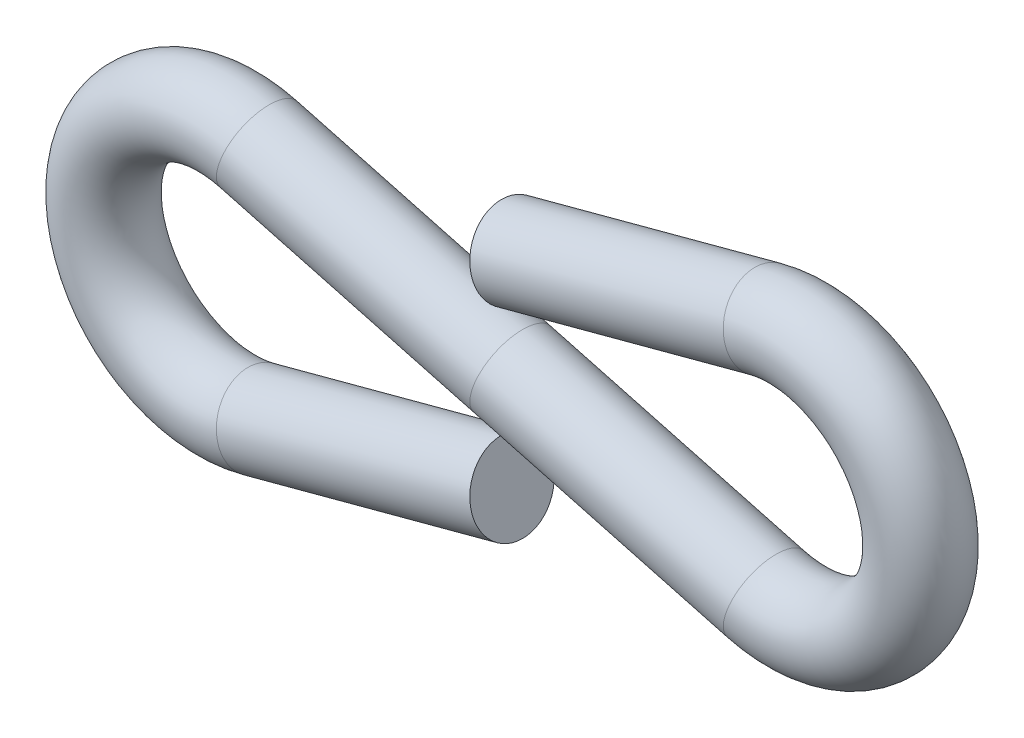
ISO-10303-21;
HEADER;
FILE_DESCRIPTION(('STEP AP214'),'2;1');
FILE_NAME('part.step','',(''),(''),'','','');
FILE_SCHEMA(('AUTOMOTIVE_DESIGN { 1 0 10303 214 1 1 1 1 }'));
ENDSEC;
DATA;
#1=APPLICATION_CONTEXT('core data for automotive mechanical design processes');
#2=APPLICATION_PROTOCOL_DEFINITION('international standard','automotive_design',2000,#1);
#3=PRODUCT_CONTEXT('',#1,'mechanical');
#4=PRODUCT('Part','Part','',(#3));
#5=PRODUCT_RELATED_PRODUCT_CATEGORY('part','',(#4));
#6=PRODUCT_DEFINITION_FORMATION('','',#4);
#7=PRODUCT_DEFINITION_CONTEXT('part definition',#1,'design');
#8=PRODUCT_DEFINITION('design','',#6,#7);
#9=PRODUCT_DEFINITION_SHAPE('','',#8);
#10=(LENGTH_UNIT() NAMED_UNIT(*) SI_UNIT(.MILLI.,.METRE.));
#11=(NAMED_UNIT(*) PLANE_ANGLE_UNIT() SI_UNIT($,.RADIAN.));
#12=(NAMED_UNIT(*) SI_UNIT($,.STERADIAN.) SOLID_ANGLE_UNIT());
#13=UNCERTAINTY_MEASURE_WITH_UNIT(LENGTH_MEASURE(1.E-05),#10,'distance_accuracy_value','');
#14=(GEOMETRIC_REPRESENTATION_CONTEXT(3) GLOBAL_UNCERTAINTY_ASSIGNED_CONTEXT((#13)) GLOBAL_UNIT_ASSIGNED_CONTEXT((#10,
#11,#12)) REPRESENTATION_CONTEXT('',''));
#15=CARTESIAN_POINT('',(0.,0.,0.));
#16=DIRECTION('',(0.,0.,1.));
#17=DIRECTION('',(1.,0.,0.));
#18=AXIS2_PLACEMENT_3D('',#15,#16,#17);
#19=CARTESIAN_POINT('',(0.,7.5,0.));
#20=DIRECTION('',(-0.965925826289069,-0.258819045102518,0.));
#21=DIRECTION('',(0.258819045102518,-0.965925826289069,0.));
#22=AXIS2_PLACEMENT_3D('',#19,#20,#21);
#23=PLANE('',#22);
#24=CARTESIAN_POINT('',(0.,7.5,0.));
#25=DIRECTION('',(-0.965925826289069,-0.258819045102518,0.));
#26=DIRECTION('',(0.258819045102518,-0.965925826289069,0.));
#27=AXIS2_PLACEMENT_3D('',#24,#25,#26);
#28=CIRCLE('',#27,3.);
#29=CARTESIAN_POINT('',(-0.776457135307554,10.3977774788672,0.));
#30=VERTEX_POINT('',#29);
#31=EDGE_CURVE('E72',#30,#30,#28,.T.);
#32=ORIENTED_EDGE('',*,*,#31,.T.);
#33=EDGE_LOOP('',(#32));
#34=FACE_BOUND('',#33,.T.);
#35=ADVANCED_FACE('F47',(#34),#23,.T.);
#36=CARTESIAN_POINT('',(0.,-7.5,0.));
#37=DIRECTION('',(-0.965925826289069,-0.258819045102518,0.));
#38=DIRECTION('',(0.258819045102518,-0.965925826289069,0.));
#39=AXIS2_PLACEMENT_3D('',#36,#37,#38);
#40=PLANE('',#39);
#41=CARTESIAN_POINT('',(0.,-7.5,0.));
#42=DIRECTION('',(-0.965925826289069,-0.258819045102518,0.));
#43=DIRECTION('',(0.258819045102518,-0.965925826289069,0.));
#44=AXIS2_PLACEMENT_3D('',#41,#42,#43);
#45=CIRCLE('',#44,3.);
#46=CARTESIAN_POINT('',(0.776457135307553,-10.3977774788672,0.));
#47=VERTEX_POINT('',#46);
#48=EDGE_CURVE('E11',#47,#47,#45,.T.);
#49=ORIENTED_EDGE('',*,*,#48,.F.);
#50=EDGE_LOOP('',(#49));
#51=FACE_BOUND('',#50,.T.);
#52=ADVANCED_FACE('F80',(#51),#40,.F.);
#53=CARTESIAN_POINT('',(0.,7.5,0.));
#54=DIRECTION('',(0.965925826289069,0.258819045102518,0.));
#55=DIRECTION('',(-0.258819045102518,0.965925826289069,0.));
#56=AXIS2_PLACEMENT_3D('',#53,#54,#55);
#57=CYLINDRICAL_SURFACE('',#56,3.);
#58=CARTESIAN_POINT('',(18.6132067983405,12.4873937301687,0.));
#59=DIRECTION('',(-0.965925826289069,-0.258819045102518,0.));
#60=DIRECTION('',(0.258819045102518,-0.965925826289069,0.));
#61=AXIS2_PLACEMENT_3D('',#58,#59,#60);
#62=CIRCLE('',#61,3.);
#63=CARTESIAN_POINT('',(17.8367496630329,15.385171209036,0.));
#64=VERTEX_POINT('',#63);
#65=EDGE_CURVE('E69',#64,#64,#62,.T.);
#66=CARTESIAN_POINT('',(17.8367496630329,15.385171209036,0.));
#67=CARTESIAN_POINT('',(17.6428620922169,15.3332191910134,0.));
#68=CARTESIAN_POINT('',(17.4489745214008,15.2812671729908,0.));
#69=CARTESIAN_POINT('',(17.0611993797687,15.1773631369456,0.));
#70=CARTESIAN_POINT('',(16.8673118089527,15.125411118923,0.));
#71=CARTESIAN_POINT('',(16.4795366673206,15.0215070828778,0.));
#72=CARTESIAN_POINT('',(16.2856490965045,14.9695550648552,0.));
#73=CARTESIAN_POINT('',(15.8978739548724,14.86565102881,0.));
#74=CARTESIAN_POINT('',(15.7039863840564,14.8136990107875,0.));
#75=CARTESIAN_POINT('',(15.3162112424243,14.7097949747423,0.));
#76=CARTESIAN_POINT('',(15.1223236716082,14.6578429567197,0.));
#77=CARTESIAN_POINT('',(14.7345485299762,14.5539389206745,0.));
#78=CARTESIAN_POINT('',(14.5406609591601,14.5019869026519,0.));
#79=CARTESIAN_POINT('',(14.152885817528,14.3980828666067,0.));
#80=CARTESIAN_POINT('',(13.958998246712,14.3461308485841,0.));
#81=CARTESIAN_POINT('',(13.5712231050799,14.2422268125389,0.));
#82=CARTESIAN_POINT('',(13.3773355342638,14.1902747945164,0.));
#83=CARTESIAN_POINT('',(12.9895603926317,14.0863707584712,0.));
#84=CARTESIAN_POINT('',(12.7956728218157,14.0344187404486,0.));
#85=CARTESIAN_POINT('',(12.4078976801836,13.9305147044034,0.));
#86=CARTESIAN_POINT('',(12.2140101093676,13.8785626863808,0.));
#87=CARTESIAN_POINT('',(11.8262349677355,13.7746586503356,0.));
#88=CARTESIAN_POINT('',(11.6323473969194,13.722706632313,0.));
#89=CARTESIAN_POINT('',(11.2445722552873,13.6188025962679,0.));
#90=CARTESIAN_POINT('',(11.0506846844713,13.5668505782453,0.));
#91=CARTESIAN_POINT('',(10.6629095428392,13.4629465422001,0.));
#92=CARTESIAN_POINT('',(10.4690219720231,13.4109945241775,0.));
#93=CARTESIAN_POINT('',(10.081246830391,13.3070904881323,0.));
#94=CARTESIAN_POINT('',(9.887359259575,13.2551384701097,0.));
#95=CARTESIAN_POINT('',(9.4995841179429,13.1512344340645,0.));
#96=CARTESIAN_POINT('',(9.30569654712686,13.0992824160419,0.));
#97=CARTESIAN_POINT('',(8.91792140549476,12.9953783799968,0.));
#98=CARTESIAN_POINT('',(8.72403383467872,12.9434263619742,0.));
#99=CARTESIAN_POINT('',(8.33625869304663,12.839522325929,0.));
#100=CARTESIAN_POINT('',(8.14237112223058,12.7875703079064,0.));
#101=CARTESIAN_POINT('',(7.75459598059849,12.6836662718612,0.));
#102=CARTESIAN_POINT('',(7.56070840978244,12.6317142538386,0.));
#103=CARTESIAN_POINT('',(7.17293326815035,12.5278102177934,0.));
#104=CARTESIAN_POINT('',(6.9790456973343,12.4758581997709,0.));
#105=CARTESIAN_POINT('',(6.59127055570221,12.3719541637257,0.));
#106=CARTESIAN_POINT('',(6.39738298488616,12.3200021457031,0.));
#107=CARTESIAN_POINT('',(6.00960784325407,12.2160981096579,0.));
#108=CARTESIAN_POINT('',(5.81572027243802,12.1641460916353,0.));
#109=CARTESIAN_POINT('',(5.42794513080593,12.0602420555901,0.));
#110=CARTESIAN_POINT('',(5.23405755998988,12.0082900375675,0.));
#111=CARTESIAN_POINT('',(4.84628241835779,11.9043860015223,0.));
#112=CARTESIAN_POINT('',(4.65239484754174,11.8524339834998,0.));
#113=CARTESIAN_POINT('',(4.26461970590965,11.7485299474546,0.));
#114=CARTESIAN_POINT('',(4.07073213509361,11.696577929432,0.));
#115=CARTESIAN_POINT('',(3.68295699346151,11.5926738933868,0.));
#116=CARTESIAN_POINT('',(3.48906942264547,11.5407218753642,0.));
#117=CARTESIAN_POINT('',(3.10129428101337,11.436817839319,0.));
#118=CARTESIAN_POINT('',(2.90740671019733,11.3848658212964,0.));
#119=CARTESIAN_POINT('',(2.51963156856523,11.2809617852513,0.));
#120=CARTESIAN_POINT('',(2.32574399774919,11.2290097672287,0.));
#121=CARTESIAN_POINT('',(1.9379688561171,11.1251057311835,0.));
#122=CARTESIAN_POINT('',(1.74408128530105,11.0731537131609,0.));
#123=CARTESIAN_POINT('',(1.35630614366896,10.9692496771157,0.));
#124=CARTESIAN_POINT('',(1.16241857285291,10.9172976590931,0.));
#125=CARTESIAN_POINT('',(0.774643431220817,10.8133936230479,0.));
#126=CARTESIAN_POINT('',(0.58075586040477,10.7614416050253,0.));
#127=CARTESIAN_POINT('',(0.192980718772676,10.6575375689802,0.));
#128=CARTESIAN_POINT('',(-0.00090685204337003,10.6055855509576,0.));
#129=CARTESIAN_POINT('',(-0.388681993675462,10.5016815149124,0.));
#130=CARTESIAN_POINT('',(-0.582569564491509,10.4497294968898,0.));
#131=CARTESIAN_POINT('',(-0.776457135307555,10.3977774788672,0.));
#132=B_SPLINE_CURVE_WITH_KNOTS('',3,(#66,#67,#68,#69,#70,#71,#72,#73,#74,#75,#76,#77,#78,#79,
#80,#81,#82,#83,#84,#85,#86,#87,#88,#89,#90,#91,#92,#93,#94,#95,#96,#97,#98,#99,#100,#101,#102,
#103,#104,#105,#106,#107,#108,#109,#110,#111,#112,#113,#114,#115,#116,#117,#118,#119,#120,#121,
#122,#123,#124,#125,#126,#127,#128,#129,#130,#131),.UNSPECIFIED.,.F.,.F.,(4,2,2,2,2,2,2,2,2,2,2,
2,2,2,2,2,2,2,2,2,2,2,2,2,2,2,2,2,2,2,2,2,4),(0.,0.602181551230274,1.20436310246055,
1.80654465369083,2.40872620492111,3.01090775615139,3.61308930738166,4.21527085861194,
4.81745240984222,5.4196339610725,6.02181551230277,6.62399706353305,7.22617861476333,
7.82836016599361,8.43054171722388,9.03272326845416,9.63490481968444,10.2370863709147,
10.839267922145,11.4414494733753,12.0436310246055,12.6458125758358,13.2479941270661,
13.8501756782964,14.4523572295267,15.0545387807569,15.6567203319872,16.2589018832175,
16.8610834344478,17.463264985678,18.0654465369083,18.6676280881386,19.2698096393689),.UNSPECIFIED.);
#133=EDGE_CURVE('BSEAM77',#64,#30,#132,.T.);
#134=ORIENTED_EDGE('',*,*,#65,.T.);
#135=ORIENTED_EDGE('',*,*,#31,.F.);
#136=ORIENTED_EDGE('',*,*,#133,.T.);
#137=ORIENTED_EDGE('',*,*,#133,.F.);
#138=EDGE_LOOP('',(#134,#136,#135,#137));
#139=FACE_BOUND('',#138,.T.);
#140=ADVANCED_FACE('F77',(#139),#57,.T.);
#141=CARTESIAN_POINT('',(20.9543843922919,3.75,0.));
#142=DIRECTION('',(0.,0.,-1.));
#143=DIRECTION('',(-1.,0.,0.));
#144=AXIS2_PLACEMENT_3D('',#141,#142,#143);
#145=TOROIDAL_SURFACE('',#144,9.0456156077081,3.);
#146=CARTESIAN_POINT('',(18.6132067983405,-4.98739373016875,0.));
#147=DIRECTION('',(0.965925826289069,-0.258819045102517,0.));
#148=DIRECTION('',(0.258819045102517,0.96592582628907,0.));
#149=AXIS2_PLACEMENT_3D('',#146,#147,#148);
#150=CIRCLE('',#149,3.);
#151=CARTESIAN_POINT('',(17.8367496630329,-7.88517120903596,0.));
#152=VERTEX_POINT('',#151);
#153=EDGE_CURVE('E66',#152,#152,#150,.T.);
#154=CARTESIAN_POINT('',(20.9543843922919,3.75,0.));
#155=DIRECTION('',(0.,0.,-1.));
#156=DIRECTION('',(-1.,0.,0.));
#157=AXIS2_PLACEMENT_3D('',#154,#155,#156);
#158=CIRCLE('',#157,12.0456156077081);
#159=EDGE_CURVE('',#64,#152,#158,.T.);
#160=ORIENTED_EDGE('',*,*,#65,.F.);
#161=ORIENTED_EDGE('',*,*,#153,.T.);
#162=ORIENTED_EDGE('',*,*,#159,.T.);
#163=ORIENTED_EDGE('',*,*,#159,.F.);
#164=EDGE_LOOP('',(#160,#162,#161,#163));
#165=FACE_BOUND('',#164,.T.);
#166=ADVANCED_FACE('F79',(#165),#145,.T.);
#167=CARTESIAN_POINT('',(18.6132067983405,-4.98739373016874,0.));
#168=DIRECTION('',(-0.965925826289069,0.258819045102518,0.));
#169=DIRECTION('',(-0.258819045102518,-0.965925826289069,0.));
#170=AXIS2_PLACEMENT_3D('',#167,#168,#169);
#171=CYLINDRICAL_SURFACE('',#170,3.);
#172=CARTESIAN_POINT('',(0.,0.,0.));
#173=DIRECTION('',(0.965925826289069,-0.258819045102518,0.));
#174=DIRECTION('',(0.258819045102518,0.965925826289069,0.));
#175=AXIS2_PLACEMENT_3D('',#172,#173,#174);
#176=CIRCLE('',#175,3.);
#177=CARTESIAN_POINT('',(0.776457135307556,2.89777747886721,0.));
#178=VERTEX_POINT('',#177);
#179=EDGE_CURVE('E61',#178,#178,#176,.T.);
#180=ORIENTED_EDGE('',*,*,#179,.T.);
#181=EDGE_LOOP('',(#180));
#182=FACE_BOUND('',#181,.T.);
#183=ORIENTED_EDGE('',*,*,#153,.F.);
#184=EDGE_LOOP('',(#183));
#185=FACE_BOUND('',#184,.T.);
#186=ADVANCED_FACE('F87',(#182,#185),#171,.T.);
#187=CARTESIAN_POINT('',(0.,0.,0.));
#188=DIRECTION('',(-0.965925826289069,0.258819045102518,0.));
#189=DIRECTION('',(-0.258819045102518,-0.965925826289069,0.));
#190=AXIS2_PLACEMENT_3D('',#187,#188,#189);
#191=CYLINDRICAL_SURFACE('',#190,3.);
#192=CARTESIAN_POINT('',(-18.6132067983404,4.98739373016875,0.));
#193=DIRECTION('',(0.965925826289069,-0.258819045102518,0.));
#194=DIRECTION('',(0.258819045102518,0.965925826289069,0.));
#195=AXIS2_PLACEMENT_3D('',#192,#193,#194);
#196=CIRCLE('',#195,3.);
#197=CARTESIAN_POINT('',(-17.8367496630329,7.88517120903595,0.));
#198=VERTEX_POINT('',#197);
#199=EDGE_CURVE('E57',#198,#198,#196,.T.);
#200=ORIENTED_EDGE('',*,*,#199,.T.);
#201=EDGE_LOOP('',(#200));
#202=FACE_BOUND('',#201,.T.);
#203=ORIENTED_EDGE('',*,*,#179,.F.);
#204=EDGE_LOOP('',(#203));
#205=FACE_BOUND('',#204,.T.);
#206=ADVANCED_FACE('F98',(#202,#205),#191,.T.);
#207=CARTESIAN_POINT('',(-20.9543843922919,-3.75,0.));
#208=DIRECTION('',(0.,0.,1.));
#209=DIRECTION('',(1.,0.,0.));
#210=AXIS2_PLACEMENT_3D('',#207,#208,#209);
#211=TOROIDAL_SURFACE('',#210,9.0456156077081,3.);
#212=CARTESIAN_POINT('',(-18.6132067983405,-12.4873937301687,0.));
#213=DIRECTION('',(-0.965925826289069,-0.258819045102518,0.));
#214=DIRECTION('',(0.258819045102518,-0.965925826289069,0.));
#215=AXIS2_PLACEMENT_3D('',#212,#213,#214);
#216=CIRCLE('',#215,3.);
#217=CARTESIAN_POINT('',(-17.8367496630329,-15.385171209036,0.));
#218=VERTEX_POINT('',#217);
#219=EDGE_CURVE('E53',#218,#218,#216,.T.);
#220=CARTESIAN_POINT('',(-20.9543843922919,-3.75,0.));
#221=DIRECTION('',(0.,0.,1.));
#222=DIRECTION('',(1.,0.,0.));
#223=AXIS2_PLACEMENT_3D('',#220,#221,#222);
#224=CIRCLE('',#223,12.0456156077081);
#225=EDGE_CURVE('',#198,#218,#224,.T.);
#226=ORIENTED_EDGE('',*,*,#199,.F.);
#227=ORIENTED_EDGE('',*,*,#219,.T.);
#228=ORIENTED_EDGE('',*,*,#225,.T.);
#229=ORIENTED_EDGE('',*,*,#225,.F.);
#230=EDGE_LOOP('',(#226,#228,#227,#229));
#231=FACE_BOUND('',#230,.T.);
#232=ADVANCED_FACE('F93',(#231),#211,.T.);
#233=CARTESIAN_POINT('',(-18.6132067983405,-12.4873937301687,0.));
#234=DIRECTION('',(0.965925826289069,0.258819045102518,0.));
#235=DIRECTION('',(-0.258819045102518,0.965925826289069,0.));
#236=AXIS2_PLACEMENT_3D('',#233,#234,#235);
#237=CYLINDRICAL_SURFACE('',#236,3.);
#238=ORIENTED_EDGE('',*,*,#48,.T.);
#239=EDGE_LOOP('',(#238));
#240=FACE_BOUND('',#239,.T.);
#241=ORIENTED_EDGE('',*,*,#219,.F.);
#242=EDGE_LOOP('',(#241));
#243=FACE_BOUND('',#242,.T.);
#244=ADVANCED_FACE('F91',(#240,#243),#237,.T.);
#245=CLOSED_SHELL('',(#35,#52,#140,#166,#186,#206,#232,#244));
#246=MANIFOLD_SOLID_BREP('B2',#245);
#247=ADVANCED_BREP_SHAPE_REPRESENTATION('',(#18,#246),#14);
#248=SHAPE_DEFINITION_REPRESENTATION(#9,#247);
ENDSEC;
END-ISO-10303-21;
